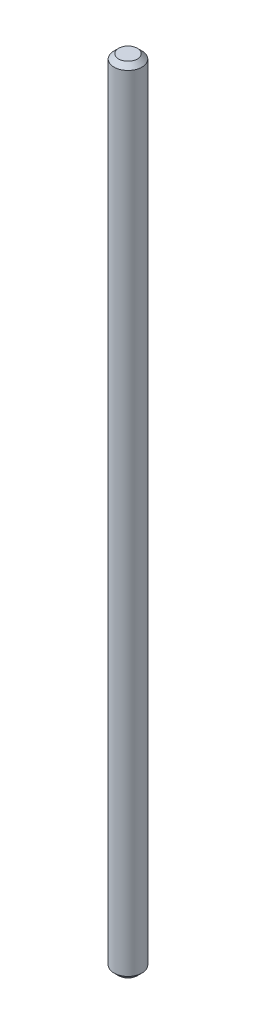
ISO-10303-21;
HEADER;
FILE_DESCRIPTION(('STEP AP214'),'2;1');
FILE_NAME('part.step','',(''),(''),'','','');
FILE_SCHEMA(('AUTOMOTIVE_DESIGN { 1 0 10303 214 1 1 1 1 }'));
ENDSEC;
DATA;
#1=APPLICATION_CONTEXT('core data for automotive mechanical design processes');
#2=APPLICATION_PROTOCOL_DEFINITION('international standard','automotive_design',2000,#1);
#3=PRODUCT_CONTEXT('',#1,'mechanical');
#4=PRODUCT('Part','Part','',(#3));
#5=PRODUCT_RELATED_PRODUCT_CATEGORY('part','',(#4));
#6=PRODUCT_DEFINITION_FORMATION('','',#4);
#7=PRODUCT_DEFINITION_CONTEXT('part definition',#1,'design');
#8=PRODUCT_DEFINITION('design','',#6,#7);
#9=PRODUCT_DEFINITION_SHAPE('','',#8);
#10=(LENGTH_UNIT() NAMED_UNIT(*) SI_UNIT(.MILLI.,.METRE.));
#11=(NAMED_UNIT(*) PLANE_ANGLE_UNIT() SI_UNIT($,.RADIAN.));
#12=(NAMED_UNIT(*) SI_UNIT($,.STERADIAN.) SOLID_ANGLE_UNIT());
#13=UNCERTAINTY_MEASURE_WITH_UNIT(LENGTH_MEASURE(1.E-05),#10,'distance_accuracy_value','');
#14=(GEOMETRIC_REPRESENTATION_CONTEXT(3) GLOBAL_UNCERTAINTY_ASSIGNED_CONTEXT((#13)) GLOBAL_UNIT_ASSIGNED_CONTEXT((#10,
#11,#12)) REPRESENTATION_CONTEXT('',''));
#15=CARTESIAN_POINT('',(0.,0.,0.));
#16=DIRECTION('',(0.,0.,1.));
#17=DIRECTION('',(1.,0.,0.));
#18=AXIS2_PLACEMENT_3D('',#15,#16,#17);
#19=CARTESIAN_POINT('',(0.,85.,0.));
#20=DIRECTION('',(0.,-1.,0.));
#21=DIRECTION('',(0.,0.,-1.));
#22=AXIS2_PLACEMENT_3D('',#19,#20,#21);
#23=CYLINDRICAL_SURFACE('',#22,1.5);
#24=CARTESIAN_POINT('',(0.,84.5,0.));
#25=DIRECTION('',(0.,1.,0.));
#26=DIRECTION('',(0.,0.,1.));
#27=AXIS2_PLACEMENT_3D('',#24,#25,#26);
#28=CIRCLE('',#27,1.5);
#29=CARTESIAN_POINT('',(0.,84.5,1.5));
#30=VERTEX_POINT('',#29);
#31=EDGE_CURVE('E41',#30,#30,#28,.F.);
#32=ORIENTED_EDGE('',*,*,#31,.T.);
#33=EDGE_LOOP('',(#32));
#34=FACE_BOUND('',#33,.T.);
#35=CARTESIAN_POINT('',(0.,0.500000000000028,0.));
#36=DIRECTION('',(0.,1.,0.));
#37=DIRECTION('',(0.,0.,1.));
#38=AXIS2_PLACEMENT_3D('',#35,#36,#37);
#39=CIRCLE('',#38,1.5);
#40=CARTESIAN_POINT('',(0.,0.500000000000028,1.5));
#41=VERTEX_POINT('',#40);
#42=EDGE_CURVE('E45',#41,#41,#39,.T.);
#43=ORIENTED_EDGE('',*,*,#42,.T.);
#44=EDGE_LOOP('',(#43));
#45=FACE_BOUND('',#44,.T.);
#46=ADVANCED_FACE('F34',(#34,#45),#23,.T.);
#47=CARTESIAN_POINT('',(0.,85.,0.));
#48=DIRECTION('',(0.,1.,0.));
#49=DIRECTION('',(0.,0.,1.));
#50=AXIS2_PLACEMENT_3D('',#47,#48,#49);
#51=PLANE('',#50);
#52=CARTESIAN_POINT('',(0.,85.,0.));
#53=DIRECTION('',(0.,1.,0.));
#54=DIRECTION('',(0.,0.,1.));
#55=AXIS2_PLACEMENT_3D('',#52,#53,#54);
#56=CIRCLE('',#55,1.00000000000001);
#57=CARTESIAN_POINT('',(0.,85.,1.00000000000001));
#58=VERTEX_POINT('',#57);
#59=EDGE_CURVE('E49',#58,#58,#56,.T.);
#60=ORIENTED_EDGE('',*,*,#59,.T.);
#61=EDGE_LOOP('',(#60));
#62=FACE_BOUND('',#61,.T.);
#63=ADVANCED_FACE('F55',(#62),#51,.T.);
#64=CARTESIAN_POINT('',(0.,0.,0.));
#65=DIRECTION('',(0.,1.,0.));
#66=DIRECTION('',(0.,0.,1.));
#67=AXIS2_PLACEMENT_3D('',#64,#65,#66);
#68=PLANE('',#67);
#69=CARTESIAN_POINT('',(0.,0.,0.));
#70=DIRECTION('',(0.,1.,0.));
#71=DIRECTION('',(0.,0.,1.));
#72=AXIS2_PLACEMENT_3D('',#69,#70,#71);
#73=CIRCLE('',#72,0.99999999999998);
#74=CARTESIAN_POINT('',(0.,0.,0.99999999999998));
#75=VERTEX_POINT('',#74);
#76=EDGE_CURVE('E10',#75,#75,#73,.F.);
#77=ORIENTED_EDGE('',*,*,#76,.T.);
#78=EDGE_LOOP('',(#77));
#79=FACE_BOUND('',#78,.T.);
#80=ADVANCED_FACE('F59',(#79),#68,.F.);
#81=CARTESIAN_POINT('',(0.,85.,0.));
#82=DIRECTION('',(0.,-1.,0.));
#83=DIRECTION('',(0.,0.,-1.));
#84=AXIS2_PLACEMENT_3D('',#81,#82,#83);
#85=CONICAL_SURFACE('',#84,1.00000000000001,0.785398163397454);
#86=ORIENTED_EDGE('',*,*,#31,.F.);
#87=EDGE_LOOP('',(#86));
#88=FACE_BOUND('',#87,.T.);
#89=ORIENTED_EDGE('',*,*,#59,.F.);
#90=EDGE_LOOP('',(#89));
#91=FACE_BOUND('',#90,.T.);
#92=ADVANCED_FACE('F57',(#88,#91),#85,.T.);
#93=CARTESIAN_POINT('',(0.,0.500000000000028,0.));
#94=DIRECTION('',(0.,1.,0.));
#95=DIRECTION('',(0.,0.,1.));
#96=AXIS2_PLACEMENT_3D('',#93,#94,#95);
#97=CONICAL_SURFACE('',#96,1.5,0.78539816339744);
#98=ORIENTED_EDGE('',*,*,#76,.F.);
#99=EDGE_LOOP('',(#98));
#100=FACE_BOUND('',#99,.T.);
#101=ORIENTED_EDGE('',*,*,#42,.F.);
#102=EDGE_LOOP('',(#101));
#103=FACE_BOUND('',#102,.T.);
#104=ADVANCED_FACE('F36',(#100,#103),#97,.T.);
#105=CLOSED_SHELL('',(#46,#63,#80,#92,#104));
#106=MANIFOLD_SOLID_BREP('B2',#105);
#107=ADVANCED_BREP_SHAPE_REPRESENTATION('',(#18,#106),#14);
#108=SHAPE_DEFINITION_REPRESENTATION(#9,#107);
ENDSEC;
END-ISO-10303-21;
